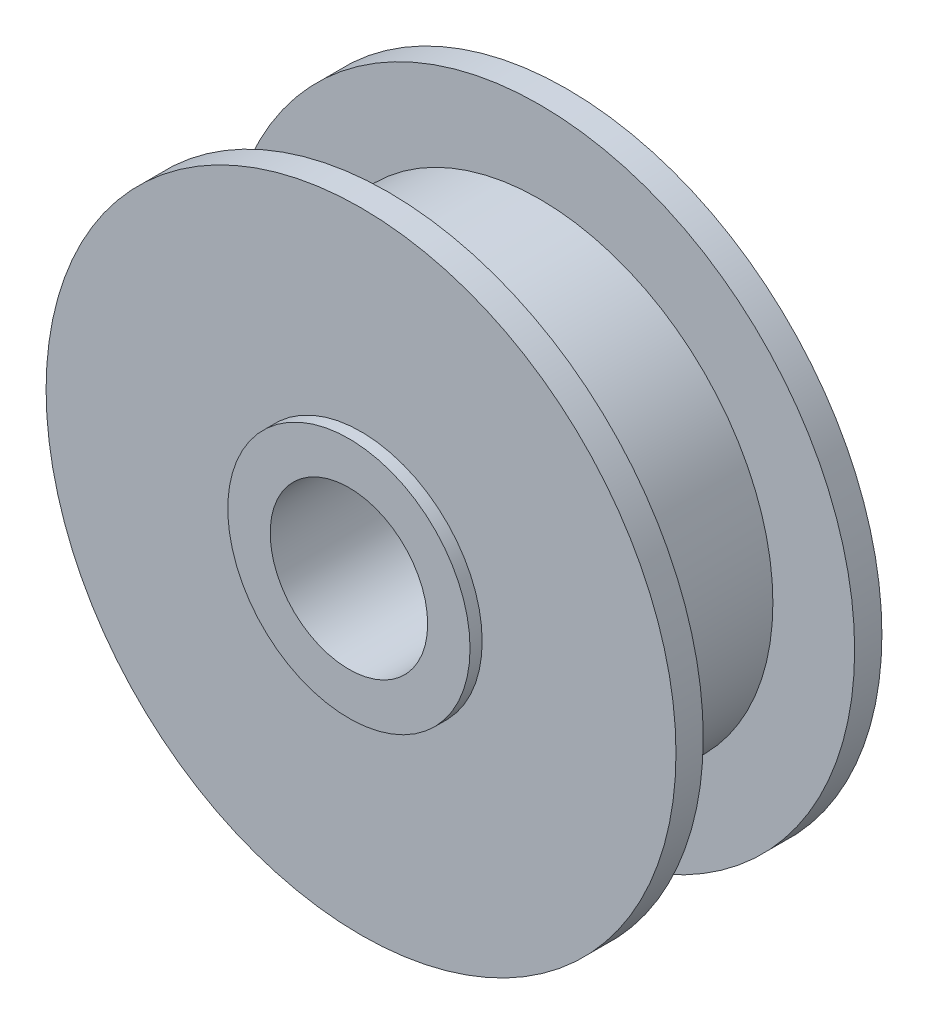
ISO-10303-21;
HEADER;
FILE_DESCRIPTION(('STEP AP214'),'2;1');
FILE_NAME('part.step','',(''),(''),'','','');
FILE_SCHEMA(('AUTOMOTIVE_DESIGN { 1 0 10303 214 1 1 1 1 }'));
ENDSEC;
DATA;
#1=APPLICATION_CONTEXT('core data for automotive mechanical design processes');
#2=APPLICATION_PROTOCOL_DEFINITION('international standard','automotive_design',2000,#1);
#3=PRODUCT_CONTEXT('',#1,'mechanical');
#4=PRODUCT('Part','Part','',(#3));
#5=PRODUCT_RELATED_PRODUCT_CATEGORY('part','',(#4));
#6=PRODUCT_DEFINITION_FORMATION('','',#4);
#7=PRODUCT_DEFINITION_CONTEXT('part definition',#1,'design');
#8=PRODUCT_DEFINITION('design','',#6,#7);
#9=PRODUCT_DEFINITION_SHAPE('','',#8);
#10=(LENGTH_UNIT() NAMED_UNIT(*) SI_UNIT(.MILLI.,.METRE.));
#11=(NAMED_UNIT(*) PLANE_ANGLE_UNIT() SI_UNIT($,.RADIAN.));
#12=(NAMED_UNIT(*) SI_UNIT($,.STERADIAN.) SOLID_ANGLE_UNIT());
#13=UNCERTAINTY_MEASURE_WITH_UNIT(LENGTH_MEASURE(1.E-05),#10,'distance_accuracy_value','');
#14=(GEOMETRIC_REPRESENTATION_CONTEXT(3) GLOBAL_UNCERTAINTY_ASSIGNED_CONTEXT((#13)) GLOBAL_UNIT_ASSIGNED_CONTEXT((#10,
#11,#12)) REPRESENTATION_CONTEXT('',''));
#15=CARTESIAN_POINT('',(0.,0.,0.));
#16=DIRECTION('',(0.,0.,1.));
#17=DIRECTION('',(1.,0.,0.));
#18=AXIS2_PLACEMENT_3D('',#15,#16,#17);
#19=CARTESIAN_POINT('',(0.,0.,1.9));
#20=DIRECTION('',(0.,0.,1.));
#21=DIRECTION('',(1.,0.,0.));
#22=AXIS2_PLACEMENT_3D('',#19,#20,#21);
#23=CYLINDRICAL_SURFACE('',#22,1.3);
#24=CARTESIAN_POINT('',(0.,0.,-1.9));
#25=DIRECTION('',(0.,0.,1.));
#26=DIRECTION('',(1.,0.,0.));
#27=AXIS2_PLACEMENT_3D('',#24,#25,#26);
#28=CIRCLE('',#27,1.3);
#29=CARTESIAN_POINT('',(1.3,0.,-1.9));
#30=VERTEX_POINT('',#29);
#31=EDGE_CURVE('E70',#30,#30,#28,.T.);
#32=ORIENTED_EDGE('',*,*,#31,.F.);
#33=EDGE_LOOP('',(#32));
#34=FACE_BOUND('',#33,.T.);
#35=CARTESIAN_POINT('',(0.,0.,1.9));
#36=DIRECTION('',(0.,0.,1.));
#37=DIRECTION('',(1.,0.,0.));
#38=AXIS2_PLACEMENT_3D('',#35,#36,#37);
#39=CIRCLE('',#38,1.3);
#40=CARTESIAN_POINT('',(1.3,0.,1.9));
#41=VERTEX_POINT('',#40);
#42=EDGE_CURVE('E10',#41,#41,#39,.T.);
#43=ORIENTED_EDGE('',*,*,#42,.T.);
#44=EDGE_LOOP('',(#43));
#45=FACE_BOUND('',#44,.T.);
#46=ADVANCED_FACE('F30',(#34,#45),#23,.F.);
#47=CARTESIAN_POINT('',(0.,1.3,1.9));
#48=DIRECTION('',(0.,0.,-1.));
#49=DIRECTION('',(-1.,0.,0.));
#50=AXIS2_PLACEMENT_3D('',#47,#48,#49);
#51=PLANE('',#50);
#52=ORIENTED_EDGE('',*,*,#42,.F.);
#53=EDGE_LOOP('',(#52));
#54=FACE_BOUND('',#53,.T.);
#55=CARTESIAN_POINT('',(0.,0.,1.9));
#56=DIRECTION('',(0.,0.,1.));
#57=DIRECTION('',(1.,0.,0.));
#58=AXIS2_PLACEMENT_3D('',#55,#56,#57);
#59=CIRCLE('',#58,2.);
#60=CARTESIAN_POINT('',(2.,0.,1.9));
#61=VERTEX_POINT('',#60);
#62=EDGE_CURVE('E36',#61,#61,#59,.T.);
#63=ORIENTED_EDGE('',*,*,#62,.T.);
#64=EDGE_LOOP('',(#63));
#65=FACE_BOUND('',#64,.T.);
#66=ADVANCED_FACE('F77',(#54,#65),#51,.F.);
#67=CARTESIAN_POINT('',(0.,0.,1.9));
#68=DIRECTION('',(0.,0.,1.));
#69=DIRECTION('',(1.,0.,0.));
#70=AXIS2_PLACEMENT_3D('',#67,#68,#69);
#71=CYLINDRICAL_SURFACE('',#70,2.);
#72=ORIENTED_EDGE('',*,*,#62,.F.);
#73=EDGE_LOOP('',(#72));
#74=FACE_BOUND('',#73,.T.);
#75=CARTESIAN_POINT('',(0.,0.,1.7));
#76=DIRECTION('',(0.,0.,1.));
#77=DIRECTION('',(1.,0.,0.));
#78=AXIS2_PLACEMENT_3D('',#75,#76,#77);
#79=CIRCLE('',#78,2.);
#80=CARTESIAN_POINT('',(2.,0.,1.7));
#81=VERTEX_POINT('',#80);
#82=EDGE_CURVE('E40',#81,#81,#79,.T.);
#83=ORIENTED_EDGE('',*,*,#82,.T.);
#84=EDGE_LOOP('',(#83));
#85=FACE_BOUND('',#84,.T.);
#86=ADVANCED_FACE('F81',(#74,#85),#71,.T.);
#87=CARTESIAN_POINT('',(0.,2.,1.7));
#88=DIRECTION('',(0.,0.,-1.));
#89=DIRECTION('',(-1.,0.,0.));
#90=AXIS2_PLACEMENT_3D('',#87,#88,#89);
#91=PLANE('',#90);
#92=ORIENTED_EDGE('',*,*,#82,.F.);
#93=EDGE_LOOP('',(#92));
#94=FACE_BOUND('',#93,.T.);
#95=CARTESIAN_POINT('',(0.,0.,1.7));
#96=DIRECTION('',(0.,0.,1.));
#97=DIRECTION('',(1.,0.,0.));
#98=AXIS2_PLACEMENT_3D('',#95,#96,#97);
#99=CIRCLE('',#98,5.2);
#100=CARTESIAN_POINT('',(5.2,0.,1.7));
#101=VERTEX_POINT('',#100);
#102=EDGE_CURVE('E44',#101,#101,#99,.T.);
#103=ORIENTED_EDGE('',*,*,#102,.T.);
#104=EDGE_LOOP('',(#103));
#105=FACE_BOUND('',#104,.T.);
#106=ADVANCED_FACE('F86',(#94,#105),#91,.F.);
#107=CARTESIAN_POINT('',(0.,0.,1.9));
#108=DIRECTION('',(0.,0.,1.));
#109=DIRECTION('',(1.,0.,0.));
#110=AXIS2_PLACEMENT_3D('',#107,#108,#109);
#111=CYLINDRICAL_SURFACE('',#110,5.2);
#112=ORIENTED_EDGE('',*,*,#102,.F.);
#113=EDGE_LOOP('',(#112));
#114=FACE_BOUND('',#113,.T.);
#115=CARTESIAN_POINT('',(0.,0.,1.25));
#116=DIRECTION('',(0.,0.,1.));
#117=DIRECTION('',(1.,0.,0.));
#118=AXIS2_PLACEMENT_3D('',#115,#116,#117);
#119=CIRCLE('',#118,5.2);
#120=CARTESIAN_POINT('',(5.2,0.,1.25));
#121=VERTEX_POINT('',#120);
#122=EDGE_CURVE('E49',#121,#121,#119,.T.);
#123=ORIENTED_EDGE('',*,*,#122,.T.);
#124=EDGE_LOOP('',(#123));
#125=FACE_BOUND('',#124,.T.);
#126=ADVANCED_FACE('F92',(#114,#125),#111,.T.);
#127=CARTESIAN_POINT('',(0.,5.2,1.25));
#128=DIRECTION('',(0.,0.,1.));
#129=DIRECTION('',(1.,0.,0.));
#130=AXIS2_PLACEMENT_3D('',#127,#128,#129);
#131=PLANE('',#130);
#132=ORIENTED_EDGE('',*,*,#122,.F.);
#133=EDGE_LOOP('',(#132));
#134=FACE_BOUND('',#133,.T.);
#135=CARTESIAN_POINT('',(0.,0.,1.25));
#136=DIRECTION('',(0.,0.,1.));
#137=DIRECTION('',(1.,0.,0.));
#138=AXIS2_PLACEMENT_3D('',#135,#136,#137);
#139=CIRCLE('',#138,3.85);
#140=CARTESIAN_POINT('',(3.85,0.,1.25));
#141=VERTEX_POINT('',#140);
#142=EDGE_CURVE('E52',#141,#141,#139,.T.);
#143=ORIENTED_EDGE('',*,*,#142,.T.);
#144=EDGE_LOOP('',(#143));
#145=FACE_BOUND('',#144,.T.);
#146=ADVANCED_FACE('F96',(#134,#145),#131,.F.);
#147=CARTESIAN_POINT('',(0.,0.,1.9));
#148=DIRECTION('',(0.,0.,1.));
#149=DIRECTION('',(1.,0.,0.));
#150=AXIS2_PLACEMENT_3D('',#147,#148,#149);
#151=CYLINDRICAL_SURFACE('',#150,3.85);
#152=ORIENTED_EDGE('',*,*,#142,.F.);
#153=EDGE_LOOP('',(#152));
#154=FACE_BOUND('',#153,.T.);
#155=CARTESIAN_POINT('',(0.,0.,-1.25));
#156=DIRECTION('',(0.,0.,1.));
#157=DIRECTION('',(1.,0.,0.));
#158=AXIS2_PLACEMENT_3D('',#155,#156,#157);
#159=CIRCLE('',#158,3.85);
#160=CARTESIAN_POINT('',(3.85,0.,-1.25));
#161=VERTEX_POINT('',#160);
#162=EDGE_CURVE('E55',#161,#161,#159,.T.);
#163=ORIENTED_EDGE('',*,*,#162,.T.);
#164=EDGE_LOOP('',(#163));
#165=FACE_BOUND('',#164,.T.);
#166=ADVANCED_FACE('F100',(#154,#165),#151,.T.);
#167=CARTESIAN_POINT('',(0.,3.85,-1.25));
#168=DIRECTION('',(0.,0.,-1.));
#169=DIRECTION('',(-1.,0.,0.));
#170=AXIS2_PLACEMENT_3D('',#167,#168,#169);
#171=PLANE('',#170);
#172=ORIENTED_EDGE('',*,*,#162,.F.);
#173=EDGE_LOOP('',(#172));
#174=FACE_BOUND('',#173,.T.);
#175=CARTESIAN_POINT('',(0.,0.,-1.25));
#176=DIRECTION('',(0.,0.,1.));
#177=DIRECTION('',(1.,0.,0.));
#178=AXIS2_PLACEMENT_3D('',#175,#176,#177);
#179=CIRCLE('',#178,5.2);
#180=CARTESIAN_POINT('',(5.2,0.,-1.25));
#181=VERTEX_POINT('',#180);
#182=EDGE_CURVE('E58',#181,#181,#179,.T.);
#183=ORIENTED_EDGE('',*,*,#182,.T.);
#184=EDGE_LOOP('',(#183));
#185=FACE_BOUND('',#184,.T.);
#186=ADVANCED_FACE('F104',(#174,#185),#171,.F.);
#187=CARTESIAN_POINT('',(0.,0.,1.9));
#188=DIRECTION('',(0.,0.,1.));
#189=DIRECTION('',(1.,0.,0.));
#190=AXIS2_PLACEMENT_3D('',#187,#188,#189);
#191=CYLINDRICAL_SURFACE('',#190,5.2);
#192=ORIENTED_EDGE('',*,*,#182,.F.);
#193=EDGE_LOOP('',(#192));
#194=FACE_BOUND('',#193,.T.);
#195=CARTESIAN_POINT('',(0.,0.,-1.7));
#196=DIRECTION('',(0.,0.,1.));
#197=DIRECTION('',(1.,0.,0.));
#198=AXIS2_PLACEMENT_3D('',#195,#196,#197);
#199=CIRCLE('',#198,5.2);
#200=CARTESIAN_POINT('',(5.2,0.,-1.7));
#201=VERTEX_POINT('',#200);
#202=EDGE_CURVE('E61',#201,#201,#199,.T.);
#203=ORIENTED_EDGE('',*,*,#202,.T.);
#204=EDGE_LOOP('',(#203));
#205=FACE_BOUND('',#204,.T.);
#206=ADVANCED_FACE('F108',(#194,#205),#191,.T.);
#207=CARTESIAN_POINT('',(0.,5.2,-1.7));
#208=DIRECTION('',(0.,0.,1.));
#209=DIRECTION('',(1.,0.,0.));
#210=AXIS2_PLACEMENT_3D('',#207,#208,#209);
#211=PLANE('',#210);
#212=ORIENTED_EDGE('',*,*,#202,.F.);
#213=EDGE_LOOP('',(#212));
#214=FACE_BOUND('',#213,.T.);
#215=CARTESIAN_POINT('',(0.,0.,-1.7));
#216=DIRECTION('',(0.,0.,1.));
#217=DIRECTION('',(1.,0.,0.));
#218=AXIS2_PLACEMENT_3D('',#215,#216,#217);
#219=CIRCLE('',#218,2.);
#220=CARTESIAN_POINT('',(2.,0.,-1.7));
#221=VERTEX_POINT('',#220);
#222=EDGE_CURVE('E64',#221,#221,#219,.T.);
#223=ORIENTED_EDGE('',*,*,#222,.T.);
#224=EDGE_LOOP('',(#223));
#225=FACE_BOUND('',#224,.T.);
#226=ADVANCED_FACE('F112',(#214,#225),#211,.F.);
#227=CARTESIAN_POINT('',(0.,0.,1.9));
#228=DIRECTION('',(0.,0.,1.));
#229=DIRECTION('',(1.,0.,0.));
#230=AXIS2_PLACEMENT_3D('',#227,#228,#229);
#231=CYLINDRICAL_SURFACE('',#230,2.);
#232=ORIENTED_EDGE('',*,*,#222,.F.);
#233=EDGE_LOOP('',(#232));
#234=FACE_BOUND('',#233,.T.);
#235=CARTESIAN_POINT('',(0.,0.,-1.9));
#236=DIRECTION('',(0.,0.,1.));
#237=DIRECTION('',(1.,0.,0.));
#238=AXIS2_PLACEMENT_3D('',#235,#236,#237);
#239=CIRCLE('',#238,2.);
#240=CARTESIAN_POINT('',(2.,0.,-1.9));
#241=VERTEX_POINT('',#240);
#242=EDGE_CURVE('E67',#241,#241,#239,.T.);
#243=ORIENTED_EDGE('',*,*,#242,.T.);
#244=EDGE_LOOP('',(#243));
#245=FACE_BOUND('',#244,.T.);
#246=ADVANCED_FACE('F116',(#234,#245),#231,.T.);
#247=CARTESIAN_POINT('',(0.,2.,-1.9));
#248=DIRECTION('',(0.,0.,1.));
#249=DIRECTION('',(1.,0.,0.));
#250=AXIS2_PLACEMENT_3D('',#247,#248,#249);
#251=PLANE('',#250);
#252=ORIENTED_EDGE('',*,*,#242,.F.);
#253=EDGE_LOOP('',(#252));
#254=FACE_BOUND('',#253,.T.);
#255=ORIENTED_EDGE('',*,*,#31,.T.);
#256=EDGE_LOOP('',(#255));
#257=FACE_BOUND('',#256,.T.);
#258=ADVANCED_FACE('F74',(#254,#257),#251,.F.);
#259=CLOSED_SHELL('',(#46,#66,#86,#106,#126,#146,#166,#186,#206,#226,#246,#258));
#260=MANIFOLD_SOLID_BREP('B2',#259);
#261=ADVANCED_BREP_SHAPE_REPRESENTATION('',(#18,#260),#14);
#262=SHAPE_DEFINITION_REPRESENTATION(#9,#261);
ENDSEC;
END-ISO-10303-21;
